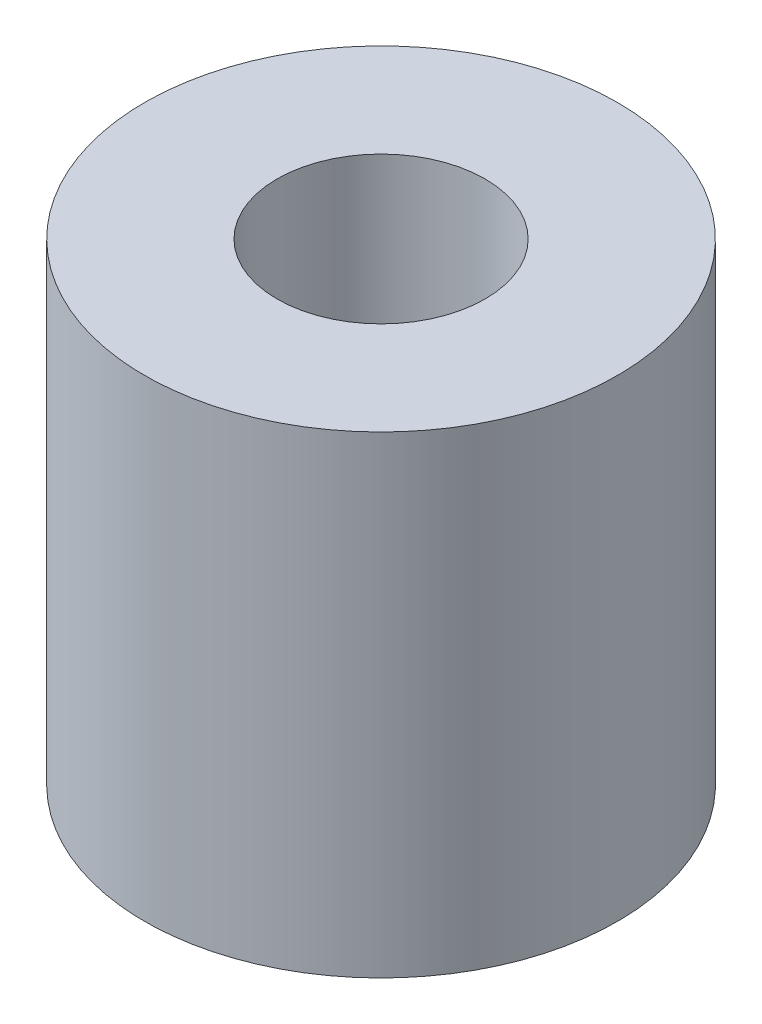
ISO-10303-21;
HEADER;
FILE_DESCRIPTION(('STEP AP214'),'2;1');
FILE_NAME('part.step','',(''),(''),'','','');
FILE_SCHEMA(('AUTOMOTIVE_DESIGN { 1 0 10303 214 1 1 1 1 }'));
ENDSEC;
DATA;
#1=APPLICATION_CONTEXT('core data for automotive mechanical design processes');
#2=APPLICATION_PROTOCOL_DEFINITION('international standard','automotive_design',2000,#1);
#3=PRODUCT_CONTEXT('',#1,'mechanical');
#4=PRODUCT('Part','Part','',(#3));
#5=PRODUCT_RELATED_PRODUCT_CATEGORY('part','',(#4));
#6=PRODUCT_DEFINITION_FORMATION('','',#4);
#7=PRODUCT_DEFINITION_CONTEXT('part definition',#1,'design');
#8=PRODUCT_DEFINITION('design','',#6,#7);
#9=PRODUCT_DEFINITION_SHAPE('','',#8);
#10=(LENGTH_UNIT() NAMED_UNIT(*) SI_UNIT(.MILLI.,.METRE.));
#11=(NAMED_UNIT(*) PLANE_ANGLE_UNIT() SI_UNIT($,.RADIAN.));
#12=(NAMED_UNIT(*) SI_UNIT($,.STERADIAN.) SOLID_ANGLE_UNIT());
#13=UNCERTAINTY_MEASURE_WITH_UNIT(LENGTH_MEASURE(1.E-05),#10,'distance_accuracy_value','');
#14=(GEOMETRIC_REPRESENTATION_CONTEXT(3) GLOBAL_UNCERTAINTY_ASSIGNED_CONTEXT((#13)) GLOBAL_UNIT_ASSIGNED_CONTEXT((#10,
#11,#12)) REPRESENTATION_CONTEXT('',''));
#15=CARTESIAN_POINT('',(0.,0.,0.));
#16=DIRECTION('',(0.,0.,1.));
#17=DIRECTION('',(1.,0.,0.));
#18=AXIS2_PLACEMENT_3D('',#15,#16,#17);
#19=CARTESIAN_POINT('',(0.,9.525,0.));
#20=DIRECTION('',(0.,1.,0.));
#21=DIRECTION('',(0.,0.,1.));
#22=AXIS2_PLACEMENT_3D('',#19,#20,#21);
#23=PLANE('',#22);
#24=CARTESIAN_POINT('',(0.,9.525,0.));
#25=DIRECTION('',(0.,1.,0.));
#26=DIRECTION('',(0.,0.,1.));
#27=AXIS2_PLACEMENT_3D('',#24,#25,#26);
#28=CIRCLE('',#27,4.7625);
#29=CARTESIAN_POINT('',(0.,9.525,-4.7625));
#30=VERTEX_POINT('',#29);
#31=EDGE_CURVE('E10',#30,#30,#28,.T.);
#32=ORIENTED_EDGE('',*,*,#31,.T.);
#33=EDGE_LOOP('',(#32));
#34=FACE_BOUND('',#33,.T.);
#35=CARTESIAN_POINT('',(0.,9.525,0.));
#36=DIRECTION('',(0.,1.,0.));
#37=DIRECTION('',(0.,0.,1.));
#38=AXIS2_PLACEMENT_3D('',#35,#36,#37);
#39=CIRCLE('',#38,2.0955);
#40=CARTESIAN_POINT('',(0.,9.525,-2.0955));
#41=VERTEX_POINT('',#40);
#42=EDGE_CURVE('E56',#41,#41,#39,.T.);
#43=ORIENTED_EDGE('',*,*,#42,.F.);
#44=EDGE_LOOP('',(#43));
#45=FACE_BOUND('',#44,.T.);
#46=ADVANCED_FACE('F43',(#34,#45),#23,.T.);
#47=CARTESIAN_POINT('',(0.,0.,0.));
#48=DIRECTION('',(0.,1.,0.));
#49=DIRECTION('',(0.,0.,1.));
#50=AXIS2_PLACEMENT_3D('',#47,#48,#49);
#51=PLANE('',#50);
#52=CARTESIAN_POINT('',(0.,0.,0.));
#53=DIRECTION('',(0.,1.,0.));
#54=DIRECTION('',(0.,0.,1.));
#55=AXIS2_PLACEMENT_3D('',#52,#53,#54);
#56=CIRCLE('',#55,4.7625);
#57=CARTESIAN_POINT('',(0.,0.,-4.7625));
#58=VERTEX_POINT('',#57);
#59=EDGE_CURVE('E47',#58,#58,#56,.T.);
#60=ORIENTED_EDGE('',*,*,#59,.F.);
#61=EDGE_LOOP('',(#60));
#62=FACE_BOUND('',#61,.T.);
#63=CARTESIAN_POINT('',(0.,0.,0.));
#64=DIRECTION('',(0.,1.,0.));
#65=DIRECTION('',(0.,0.,1.));
#66=AXIS2_PLACEMENT_3D('',#63,#64,#65);
#67=CIRCLE('',#66,2.0955);
#68=CARTESIAN_POINT('',(0.,0.,-2.0955));
#69=VERTEX_POINT('',#68);
#70=EDGE_CURVE('E58',#69,#69,#67,.T.);
#71=ORIENTED_EDGE('',*,*,#70,.T.);
#72=EDGE_LOOP('',(#71));
#73=FACE_BOUND('',#72,.T.);
#74=ADVANCED_FACE('F70',(#62,#73),#51,.F.);
#75=CARTESIAN_POINT('',(0.,9.525,0.));
#76=DIRECTION('',(0.,-1.,0.));
#77=DIRECTION('',(0.,0.,-1.));
#78=AXIS2_PLACEMENT_3D('',#75,#76,#77);
#79=CYLINDRICAL_SURFACE('',#78,4.7625);
#80=CARTESIAN_POINT('',(0.,9.525,-4.7625));
#81=CARTESIAN_POINT('',(0.,9.42578125,-4.7625));
#82=CARTESIAN_POINT('',(0.,9.3265625,-4.7625));
#83=CARTESIAN_POINT('',(0.,9.128125,-4.7625));
#84=CARTESIAN_POINT('',(0.,9.02890625,-4.7625));
#85=CARTESIAN_POINT('',(0.,8.83046875,-4.7625));
#86=CARTESIAN_POINT('',(0.,8.73125,-4.7625));
#87=CARTESIAN_POINT('',(0.,8.5328125,-4.7625));
#88=CARTESIAN_POINT('',(0.,8.43359375,-4.7625));
#89=CARTESIAN_POINT('',(0.,8.23515625,-4.7625));
#90=CARTESIAN_POINT('',(0.,8.1359375,-4.7625));
#91=CARTESIAN_POINT('',(0.,7.9375,-4.7625));
#92=CARTESIAN_POINT('',(0.,7.83828125,-4.7625));
#93=CARTESIAN_POINT('',(0.,7.63984375,-4.7625));
#94=CARTESIAN_POINT('',(0.,7.540625,-4.7625));
#95=CARTESIAN_POINT('',(0.,7.3421875,-4.7625));
#96=CARTESIAN_POINT('',(0.,7.24296875,-4.7625));
#97=CARTESIAN_POINT('',(0.,7.04453125,-4.7625));
#98=CARTESIAN_POINT('',(0.,6.9453125,-4.7625));
#99=CARTESIAN_POINT('',(0.,6.746875,-4.7625));
#100=CARTESIAN_POINT('',(0.,6.64765625,-4.7625));
#101=CARTESIAN_POINT('',(0.,6.44921875,-4.7625));
#102=CARTESIAN_POINT('',(0.,6.35,-4.7625));
#103=CARTESIAN_POINT('',(0.,6.1515625,-4.7625));
#104=CARTESIAN_POINT('',(0.,6.05234375,-4.7625));
#105=CARTESIAN_POINT('',(0.,5.85390625,-4.7625));
#106=CARTESIAN_POINT('',(0.,5.7546875,-4.7625));
#107=CARTESIAN_POINT('',(0.,5.55625,-4.7625));
#108=CARTESIAN_POINT('',(0.,5.45703125,-4.7625));
#109=CARTESIAN_POINT('',(0.,5.25859375,-4.7625));
#110=CARTESIAN_POINT('',(0.,5.159375,-4.7625));
#111=CARTESIAN_POINT('',(0.,4.9609375,-4.7625));
#112=CARTESIAN_POINT('',(0.,4.86171875,-4.7625));
#113=CARTESIAN_POINT('',(0.,4.66328125,-4.7625));
#114=CARTESIAN_POINT('',(0.,4.5640625,-4.7625));
#115=CARTESIAN_POINT('',(0.,4.365625,-4.7625));
#116=CARTESIAN_POINT('',(0.,4.26640625,-4.7625));
#117=CARTESIAN_POINT('',(0.,4.06796875,-4.7625));
#118=CARTESIAN_POINT('',(0.,3.96875,-4.7625));
#119=CARTESIAN_POINT('',(0.,3.7703125,-4.7625));
#120=CARTESIAN_POINT('',(0.,3.67109375,-4.7625));
#121=CARTESIAN_POINT('',(0.,3.47265625,-4.7625));
#122=CARTESIAN_POINT('',(0.,3.3734375,-4.7625));
#123=CARTESIAN_POINT('',(0.,3.175,-4.7625));
#124=CARTESIAN_POINT('',(0.,3.07578125,-4.7625));
#125=CARTESIAN_POINT('',(0.,2.87734375,-4.7625));
#126=CARTESIAN_POINT('',(0.,2.778125,-4.7625));
#127=CARTESIAN_POINT('',(0.,2.5796875,-4.7625));
#128=CARTESIAN_POINT('',(0.,2.48046875,-4.7625));
#129=CARTESIAN_POINT('',(0.,2.28203125,-4.7625));
#130=CARTESIAN_POINT('',(0.,2.1828125,-4.7625));
#131=CARTESIAN_POINT('',(0.,1.984375,-4.7625));
#132=CARTESIAN_POINT('',(0.,1.88515625,-4.7625));
#133=CARTESIAN_POINT('',(0.,1.68671875,-4.7625));
#134=CARTESIAN_POINT('',(0.,1.5875,-4.7625));
#135=CARTESIAN_POINT('',(0.,1.3890625,-4.7625));
#136=CARTESIAN_POINT('',(0.,1.28984375,-4.7625));
#137=CARTESIAN_POINT('',(0.,1.09140625,-4.7625));
#138=CARTESIAN_POINT('',(0.,0.992187500000001,-4.7625));
#139=CARTESIAN_POINT('',(0.,0.793750000000001,-4.7625));
#140=CARTESIAN_POINT('',(0.,0.69453125,-4.7625));
#141=CARTESIAN_POINT('',(0.,0.49609375,-4.7625));
#142=CARTESIAN_POINT('',(0.,0.396875,-4.7625));
#143=CARTESIAN_POINT('',(0.,0.1984375,-4.7625));
#144=CARTESIAN_POINT('',(0.,0.0992187500000001,-4.7625));
#145=CARTESIAN_POINT('',(0.,0.,-4.7625));
#146=B_SPLINE_CURVE_WITH_KNOTS('',3,(#80,#81,#82,#83,#84,#85,#86,#87,#88,#89,#90,#91,#92,#93,
#94,#95,#96,#97,#98,#99,#100,#101,#102,#103,#104,#105,#106,#107,#108,#109,#110,#111,#112,#113,
#114,#115,#116,#117,#118,#119,#120,#121,#122,#123,#124,#125,#126,#127,#128,#129,#130,#131,#132,
#133,#134,#135,#136,#137,#138,#139,#140,#141,#142,#143,#144,#145),.UNSPECIFIED.,.F.,.F.,(4,2,2,
2,2,2,2,2,2,2,2,2,2,2,2,2,2,2,2,2,2,2,2,2,2,2,2,2,2,2,2,2,4),(0.,0.29765625,0.5953125,
0.892968750000001,1.190625,1.48828125,1.7859375,2.08359375,2.38125,2.67890625,2.9765625,
3.27421875,3.571875,3.86953125,4.1671875,4.46484375,4.7625,5.06015625,5.3578125,5.65546875,
5.953125,6.25078125,6.5484375,6.84609375,7.14375,7.44140625,7.7390625,8.03671875,8.334375,
8.63203125,8.9296875,9.22734375,9.525),.UNSPECIFIED.);
#147=EDGE_CURVE('BSEAM45',#30,#58,#146,.T.);
#148=ORIENTED_EDGE('',*,*,#31,.F.);
#149=ORIENTED_EDGE('',*,*,#59,.T.);
#150=ORIENTED_EDGE('',*,*,#147,.T.);
#151=ORIENTED_EDGE('',*,*,#147,.F.);
#152=EDGE_LOOP('',(#148,#150,#149,#151));
#153=FACE_BOUND('',#152,.T.);
#154=ADVANCED_FACE('F45',(#153),#79,.T.);
#155=CARTESIAN_POINT('',(0.,9.525,0.));
#156=DIRECTION('',(0.,-1.,0.));
#157=DIRECTION('',(0.,0.,-1.));
#158=AXIS2_PLACEMENT_3D('',#155,#156,#157);
#159=CYLINDRICAL_SURFACE('',#158,2.0955);
#160=CARTESIAN_POINT('',(0.,9.525,-2.0955));
#161=CARTESIAN_POINT('',(0.,9.42578125,-2.0955));
#162=CARTESIAN_POINT('',(0.,9.3265625,-2.0955));
#163=CARTESIAN_POINT('',(0.,9.128125,-2.0955));
#164=CARTESIAN_POINT('',(0.,9.02890625,-2.0955));
#165=CARTESIAN_POINT('',(0.,8.83046875,-2.0955));
#166=CARTESIAN_POINT('',(0.,8.73125,-2.0955));
#167=CARTESIAN_POINT('',(0.,8.5328125,-2.0955));
#168=CARTESIAN_POINT('',(0.,8.43359375,-2.0955));
#169=CARTESIAN_POINT('',(0.,8.23515625,-2.0955));
#170=CARTESIAN_POINT('',(0.,8.1359375,-2.0955));
#171=CARTESIAN_POINT('',(0.,7.9375,-2.0955));
#172=CARTESIAN_POINT('',(0.,7.83828125,-2.0955));
#173=CARTESIAN_POINT('',(0.,7.63984375,-2.0955));
#174=CARTESIAN_POINT('',(0.,7.540625,-2.0955));
#175=CARTESIAN_POINT('',(0.,7.3421875,-2.0955));
#176=CARTESIAN_POINT('',(0.,7.24296875,-2.0955));
#177=CARTESIAN_POINT('',(0.,7.04453125,-2.0955));
#178=CARTESIAN_POINT('',(0.,6.9453125,-2.0955));
#179=CARTESIAN_POINT('',(0.,6.746875,-2.0955));
#180=CARTESIAN_POINT('',(0.,6.64765625,-2.0955));
#181=CARTESIAN_POINT('',(0.,6.44921875,-2.0955));
#182=CARTESIAN_POINT('',(0.,6.35,-2.0955));
#183=CARTESIAN_POINT('',(0.,6.1515625,-2.0955));
#184=CARTESIAN_POINT('',(0.,6.05234375,-2.0955));
#185=CARTESIAN_POINT('',(0.,5.85390625,-2.0955));
#186=CARTESIAN_POINT('',(0.,5.7546875,-2.0955));
#187=CARTESIAN_POINT('',(0.,5.55625,-2.0955));
#188=CARTESIAN_POINT('',(0.,5.45703125,-2.0955));
#189=CARTESIAN_POINT('',(0.,5.25859375,-2.0955));
#190=CARTESIAN_POINT('',(0.,5.159375,-2.0955));
#191=CARTESIAN_POINT('',(0.,4.9609375,-2.0955));
#192=CARTESIAN_POINT('',(0.,4.86171875,-2.0955));
#193=CARTESIAN_POINT('',(0.,4.66328125,-2.0955));
#194=CARTESIAN_POINT('',(0.,4.5640625,-2.0955));
#195=CARTESIAN_POINT('',(0.,4.365625,-2.0955));
#196=CARTESIAN_POINT('',(0.,4.26640625,-2.0955));
#197=CARTESIAN_POINT('',(0.,4.06796875,-2.0955));
#198=CARTESIAN_POINT('',(0.,3.96875,-2.0955));
#199=CARTESIAN_POINT('',(0.,3.7703125,-2.0955));
#200=CARTESIAN_POINT('',(0.,3.67109375,-2.0955));
#201=CARTESIAN_POINT('',(0.,3.47265625,-2.0955));
#202=CARTESIAN_POINT('',(0.,3.3734375,-2.0955));
#203=CARTESIAN_POINT('',(0.,3.175,-2.0955));
#204=CARTESIAN_POINT('',(0.,3.07578125,-2.0955));
#205=CARTESIAN_POINT('',(0.,2.87734375,-2.0955));
#206=CARTESIAN_POINT('',(0.,2.778125,-2.0955));
#207=CARTESIAN_POINT('',(0.,2.5796875,-2.0955));
#208=CARTESIAN_POINT('',(0.,2.48046875,-2.0955));
#209=CARTESIAN_POINT('',(0.,2.28203125,-2.0955));
#210=CARTESIAN_POINT('',(0.,2.1828125,-2.0955));
#211=CARTESIAN_POINT('',(0.,1.984375,-2.0955));
#212=CARTESIAN_POINT('',(0.,1.88515625,-2.0955));
#213=CARTESIAN_POINT('',(0.,1.68671875,-2.0955));
#214=CARTESIAN_POINT('',(0.,1.5875,-2.0955));
#215=CARTESIAN_POINT('',(0.,1.3890625,-2.0955));
#216=CARTESIAN_POINT('',(0.,1.28984375,-2.0955));
#217=CARTESIAN_POINT('',(0.,1.09140625,-2.0955));
#218=CARTESIAN_POINT('',(0.,0.992187500000001,-2.0955));
#219=CARTESIAN_POINT('',(0.,0.793750000000001,-2.0955));
#220=CARTESIAN_POINT('',(0.,0.69453125,-2.0955));
#221=CARTESIAN_POINT('',(0.,0.49609375,-2.0955));
#222=CARTESIAN_POINT('',(0.,0.396875,-2.0955));
#223=CARTESIAN_POINT('',(0.,0.1984375,-2.0955));
#224=CARTESIAN_POINT('',(0.,0.0992187500000001,-2.0955));
#225=CARTESIAN_POINT('',(0.,0.,-2.0955));
#226=B_SPLINE_CURVE_WITH_KNOTS('',3,(#160,#161,#162,#163,#164,#165,#166,#167,#168,#169,#170,
#171,#172,#173,#174,#175,#176,#177,#178,#179,#180,#181,#182,#183,#184,#185,#186,#187,#188,#189,
#190,#191,#192,#193,#194,#195,#196,#197,#198,#199,#200,#201,#202,#203,#204,#205,#206,#207,#208,
#209,#210,#211,#212,#213,#214,#215,#216,#217,#218,#219,#220,#221,#222,#223,#224,#225),
.UNSPECIFIED.,.F.,.F.,(4,2,2,2,2,2,2,2,2,2,2,2,2,2,2,2,2,2,2,2,2,2,2,2,2,2,2,2,2,2,2,2,4),(0.,
0.297656249999998,0.595312499999999,0.892968749999999,1.190625,1.48828125,1.7859375,2.08359375,
2.38125,2.67890625,2.9765625,3.27421875,3.571875,3.86953125,4.1671875,4.46484375,4.7625,
5.06015625,5.3578125,5.65546875,5.953125,6.25078125,6.5484375,6.84609375,7.14375,7.44140625,
7.7390625,8.03671875,8.334375,8.63203125,8.9296875,9.22734375,9.525),.UNSPECIFIED.);
#227=EDGE_CURVE('BSEAM66',#41,#69,#226,.T.);
#228=ORIENTED_EDGE('',*,*,#42,.T.);
#229=ORIENTED_EDGE('',*,*,#70,.F.);
#230=ORIENTED_EDGE('',*,*,#227,.T.);
#231=ORIENTED_EDGE('',*,*,#227,.F.);
#232=EDGE_LOOP('',(#228,#230,#229,#231));
#233=FACE_BOUND('',#232,.T.);
#234=ADVANCED_FACE('F66',(#233),#159,.F.);
#235=CLOSED_SHELL('',(#46,#74,#154,#234));
#236=MANIFOLD_SOLID_BREP('B2',#235);
#237=ADVANCED_BREP_SHAPE_REPRESENTATION('',(#18,#236),#14);
#238=SHAPE_DEFINITION_REPRESENTATION(#9,#237);
ENDSEC;
END-ISO-10303-21;
